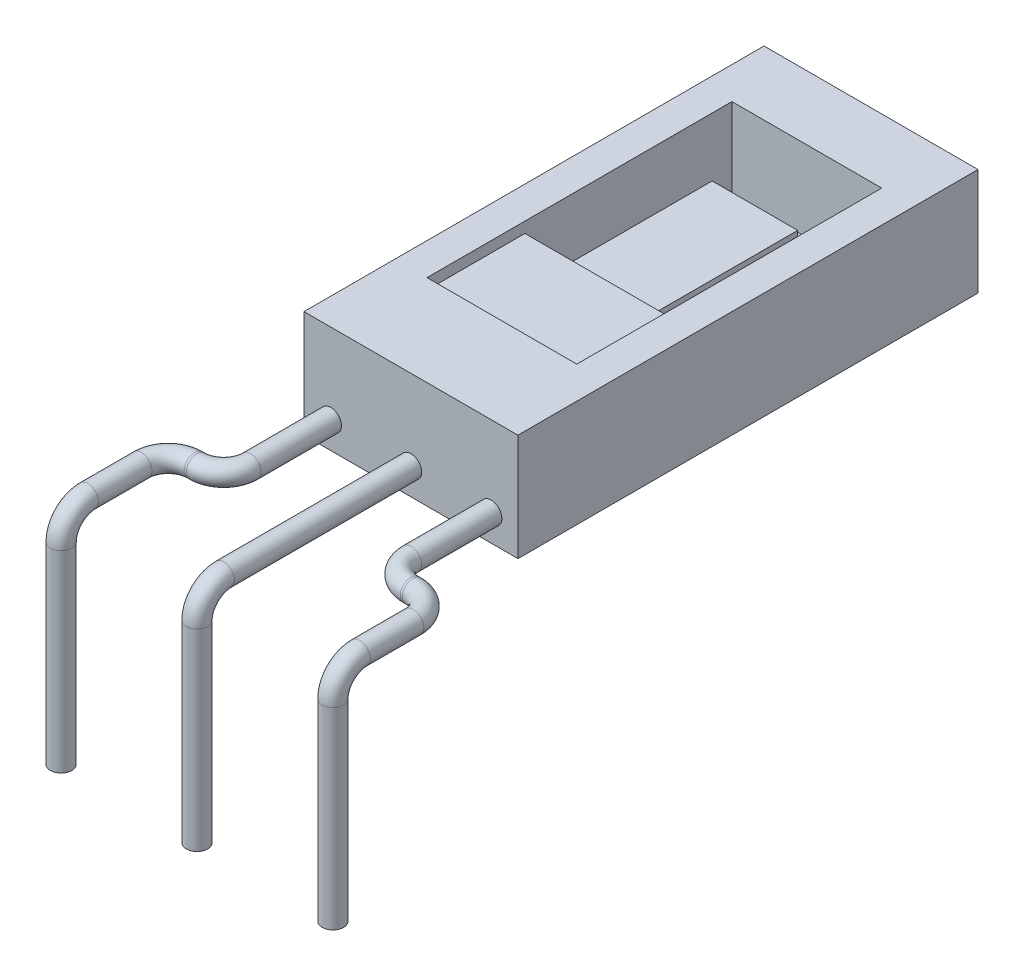
ISO-10303-21;
HEADER;
FILE_DESCRIPTION(('STEP AP214'),'2;1');
FILE_NAME('part.step','',(''),(''),'','','');
FILE_SCHEMA(('AUTOMOTIVE_DESIGN { 1 0 10303 214 1 1 1 1 }'));
ENDSEC;
DATA;
#1=APPLICATION_CONTEXT('core data for automotive mechanical design processes');
#2=APPLICATION_PROTOCOL_DEFINITION('international standard','automotive_design',2000,#1);
#3=PRODUCT_CONTEXT('',#1,'mechanical');
#4=PRODUCT('Part','Part','',(#3));
#5=PRODUCT_RELATED_PRODUCT_CATEGORY('part','',(#4));
#6=PRODUCT_DEFINITION_FORMATION('','',#4);
#7=PRODUCT_DEFINITION_CONTEXT('part definition',#1,'design');
#8=PRODUCT_DEFINITION('design','',#6,#7);
#9=PRODUCT_DEFINITION_SHAPE('','',#8);
#10=(LENGTH_UNIT() NAMED_UNIT(*) SI_UNIT(.MILLI.,.METRE.));
#11=(NAMED_UNIT(*) PLANE_ANGLE_UNIT() SI_UNIT($,.RADIAN.));
#12=(NAMED_UNIT(*) SI_UNIT($,.STERADIAN.) SOLID_ANGLE_UNIT());
#13=UNCERTAINTY_MEASURE_WITH_UNIT(LENGTH_MEASURE(1.E-05),#10,'distance_accuracy_value','');
#14=(GEOMETRIC_REPRESENTATION_CONTEXT(3) GLOBAL_UNCERTAINTY_ASSIGNED_CONTEXT((#13)) GLOBAL_UNIT_ASSIGNED_CONTEXT((#10,
#11,#12)) REPRESENTATION_CONTEXT('',''));
#15=CARTESIAN_POINT('',(0.,0.,0.));
#16=DIRECTION('',(0.,0.,1.));
#17=DIRECTION('',(1.,0.,0.));
#18=AXIS2_PLACEMENT_3D('',#15,#16,#17);
#19=CARTESIAN_POINT('',(-2.,2.,0.));
#20=DIRECTION('',(0.,0.,-1.));
#21=DIRECTION('',(-1.,0.,0.));
#22=AXIS2_PLACEMENT_3D('',#19,#20,#21);
#23=PLANE('',#22);
#24=CARTESIAN_POINT('',(1.5,0.5,0.));
#25=DIRECTION('',(0.,0.,-1.));
#26=DIRECTION('',(-1.,0.,0.));
#27=AXIS2_PLACEMENT_3D('',#24,#25,#26);
#28=CIRCLE('',#27,0.2);
#29=CARTESIAN_POINT('',(1.3,0.5,0.));
#30=VERTEX_POINT('',#29);
#31=EDGE_CURVE('E301',#30,#30,#28,.T.);
#32=ORIENTED_EDGE('',*,*,#31,.T.);
#33=EDGE_LOOP('',(#32));
#34=FACE_BOUND('',#33,.T.);
#35=CARTESIAN_POINT('',(0.,0.5,0.));
#36=DIRECTION('',(0.,0.,1.));
#37=DIRECTION('',(1.,0.,0.));
#38=AXIS2_PLACEMENT_3D('',#35,#36,#37);
#39=CIRCLE('',#38,0.2);
#40=CARTESIAN_POINT('',(0.2,0.5,0.));
#41=VERTEX_POINT('',#40);
#42=EDGE_CURVE('E46',#41,#41,#39,.T.);
#43=ORIENTED_EDGE('',*,*,#42,.F.);
#44=EDGE_LOOP('',(#43));
#45=FACE_BOUND('',#44,.T.);
#46=DIRECTION('',(1.,0.,0.));
#47=VECTOR('',#46,1.);
#48=CARTESIAN_POINT('',(-2.,0.,0.));
#49=LINE('',#48,#47);
#50=CARTESIAN_POINT('',(-2.,0.,0.));
#51=VERTEX_POINT('',#50);
#52=CARTESIAN_POINT('',(2.,0.,0.));
#53=VERTEX_POINT('',#52);
#54=EDGE_CURVE('E195',#51,#53,#49,.T.);
#55=ORIENTED_EDGE('',*,*,#54,.T.);
#56=DIRECTION('',(0.,-1.,0.));
#57=VECTOR('',#56,1.);
#58=CARTESIAN_POINT('',(2.,2.,0.));
#59=LINE('',#58,#57);
#60=CARTESIAN_POINT('',(2.,2.,0.));
#61=VERTEX_POINT('',#60);
#62=EDGE_CURVE('E169',#61,#53,#59,.T.);
#63=ORIENTED_EDGE('',*,*,#62,.F.);
#64=DIRECTION('',(1.,0.,0.));
#65=VECTOR('',#64,1.);
#66=CARTESIAN_POINT('',(-2.,2.,0.));
#67=LINE('',#66,#65);
#68=CARTESIAN_POINT('',(-2.,2.,0.));
#69=VERTEX_POINT('',#68);
#70=EDGE_CURVE('E186',#69,#61,#67,.T.);
#71=ORIENTED_EDGE('',*,*,#70,.F.);
#72=DIRECTION('',(0.,-1.,0.));
#73=VECTOR('',#72,1.);
#74=CARTESIAN_POINT('',(-2.,2.,0.));
#75=LINE('',#74,#73);
#76=EDGE_CURVE('E167',#69,#51,#75,.T.);
#77=ORIENTED_EDGE('',*,*,#76,.T.);
#78=EDGE_LOOP('',(#55,#63,#71,#77));
#79=FACE_BOUND('',#78,.T.);
#80=CARTESIAN_POINT('',(-1.5,0.5,0.));
#81=DIRECTION('',(0.,0.,1.));
#82=DIRECTION('',(1.,0.,0.));
#83=AXIS2_PLACEMENT_3D('',#80,#81,#82);
#84=CIRCLE('',#83,0.2);
#85=CARTESIAN_POINT('',(-1.3,0.5,0.));
#86=VERTEX_POINT('',#85);
#87=EDGE_CURVE('E11',#86,#86,#84,.T.);
#88=ORIENTED_EDGE('',*,*,#87,.F.);
#89=EDGE_LOOP('',(#88));
#90=FACE_BOUND('',#89,.T.);
#91=ADVANCED_FACE('F37',(#34,#45,#79,#90),#23,.F.);
#92=CARTESIAN_POINT('',(-1.4,0.5,-1.7));
#93=DIRECTION('',(0.,1.,0.));
#94=DIRECTION('',(0.,0.,1.));
#95=AXIS2_PLACEMENT_3D('',#92,#93,#94);
#96=PLANE('',#95);
#97=DIRECTION('',(1.,0.,0.));
#98=VECTOR('',#97,1.);
#99=CARTESIAN_POINT('',(-1.4,0.5,-3.53));
#100=LINE('',#99,#98);
#101=CARTESIAN_POINT('',(-1.4,0.5,-3.53));
#102=VERTEX_POINT('',#101);
#103=CARTESIAN_POINT('',(-0.8,0.5,-3.53));
#104=VERTEX_POINT('',#103);
#105=EDGE_CURVE('E41',#102,#104,#100,.T.);
#106=ORIENTED_EDGE('',*,*,#105,.T.);
#107=DIRECTION('',(0.,0.,1.));
#108=VECTOR('',#107,1.);
#109=CARTESIAN_POINT('',(-0.8,0.5,-6.43));
#110=LINE('',#109,#108);
#111=CARTESIAN_POINT('',(-0.8,0.5,-6.43));
#112=VERTEX_POINT('',#111);
#113=EDGE_CURVE('E141',#112,#104,#110,.T.);
#114=ORIENTED_EDGE('',*,*,#113,.F.);
#115=DIRECTION('',(-1.,0.,0.));
#116=VECTOR('',#115,1.);
#117=CARTESIAN_POINT('',(-0.8,0.5,-6.43));
#118=LINE('',#117,#116);
#119=CARTESIAN_POINT('',(0.800000000000001,0.5,-6.43));
#120=VERTEX_POINT('',#119);
#121=EDGE_CURVE('E248',#120,#112,#118,.T.);
#122=ORIENTED_EDGE('',*,*,#121,.F.);
#123=DIRECTION('',(0.,0.,-1.));
#124=VECTOR('',#123,1.);
#125=CARTESIAN_POINT('',(0.800000000000001,0.5,-6.43));
#126=LINE('',#125,#124);
#127=CARTESIAN_POINT('',(0.800000000000001,0.5,-3.53));
#128=VERTEX_POINT('',#127);
#129=EDGE_CURVE('E147',#128,#120,#126,.T.);
#130=ORIENTED_EDGE('',*,*,#129,.F.);
#131=CARTESIAN_POINT('',(1.4,0.5,-3.53));
#132=VERTEX_POINT('',#131);
#133=EDGE_CURVE('E62',#128,#132,#100,.T.);
#134=ORIENTED_EDGE('',*,*,#133,.T.);
#135=DIRECTION('',(0.,0.,-1.));
#136=VECTOR('',#135,1.);
#137=CARTESIAN_POINT('',(1.4,0.5,-7.4));
#138=LINE('',#137,#136);
#139=CARTESIAN_POINT('',(1.4,0.5,-7.4));
#140=VERTEX_POINT('',#139);
#141=EDGE_CURVE('E209',#132,#140,#138,.T.);
#142=ORIENTED_EDGE('',*,*,#141,.T.);
#143=DIRECTION('',(-1.,0.,0.));
#144=VECTOR('',#143,1.);
#145=CARTESIAN_POINT('',(-1.4,0.5,-7.4));
#146=LINE('',#145,#144);
#147=CARTESIAN_POINT('',(-1.4,0.5,-7.4));
#148=VERTEX_POINT('',#147);
#149=EDGE_CURVE('E203',#140,#148,#146,.T.);
#150=ORIENTED_EDGE('',*,*,#149,.T.);
#151=DIRECTION('',(0.,0.,1.));
#152=VECTOR('',#151,1.);
#153=CARTESIAN_POINT('',(-1.4,0.5,-7.4));
#154=LINE('',#153,#152);
#155=EDGE_CURVE('E164',#148,#102,#154,.T.);
#156=ORIENTED_EDGE('',*,*,#155,.T.);
#157=EDGE_LOOP('',(#106,#114,#122,#130,#134,#142,#150,#156));
#158=FACE_BOUND('',#157,.T.);
#159=ADVANCED_FACE('F161',(#158),#96,.T.);
#160=CARTESIAN_POINT('',(-1.4,1.8,-3.53));
#161=DIRECTION('',(0.,0.,1.));
#162=DIRECTION('',(1.,0.,0.));
#163=AXIS2_PLACEMENT_3D('',#160,#161,#162);
#164=PLANE('',#163);
#165=DIRECTION('',(0.,-1.,0.));
#166=VECTOR('',#165,1.);
#167=CARTESIAN_POINT('',(-0.8,1.5,-3.53));
#168=LINE('',#167,#166);
#169=CARTESIAN_POINT('',(-0.8,1.5,-3.53));
#170=VERTEX_POINT('',#169);
#171=EDGE_CURVE('E54',#170,#104,#168,.T.);
#172=ORIENTED_EDGE('',*,*,#171,.T.);
#173=ORIENTED_EDGE('',*,*,#105,.F.);
#174=DIRECTION('',(0.,-1.,0.));
#175=VECTOR('',#174,1.);
#176=CARTESIAN_POINT('',(-1.4,1.8,-3.53));
#177=LINE('',#176,#175);
#178=CARTESIAN_POINT('',(-1.4,1.8,-3.53));
#179=VERTEX_POINT('',#178);
#180=EDGE_CURVE('E229',#179,#102,#177,.T.);
#181=ORIENTED_EDGE('',*,*,#180,.F.);
#182=DIRECTION('',(-1.,0.,0.));
#183=VECTOR('',#182,1.);
#184=CARTESIAN_POINT('',(-1.4,1.8,-3.53));
#185=LINE('',#184,#183);
#186=CARTESIAN_POINT('',(1.4,1.8,-3.53));
#187=VERTEX_POINT('',#186);
#188=EDGE_CURVE('E231',#187,#179,#185,.T.);
#189=ORIENTED_EDGE('',*,*,#188,.F.);
#190=DIRECTION('',(0.,-1.,0.));
#191=VECTOR('',#190,1.);
#192=CARTESIAN_POINT('',(1.4,0.5,-3.53));
#193=LINE('',#192,#191);
#194=EDGE_CURVE('E227',#187,#132,#193,.T.);
#195=ORIENTED_EDGE('',*,*,#194,.T.);
#196=ORIENTED_EDGE('',*,*,#133,.F.);
#197=DIRECTION('',(0.,-1.,0.));
#198=VECTOR('',#197,1.);
#199=CARTESIAN_POINT('',(0.800000000000001,1.5,-3.53));
#200=LINE('',#199,#198);
#201=CARTESIAN_POINT('',(0.800000000000001,1.5,-3.53));
#202=VERTEX_POINT('',#201);
#203=EDGE_CURVE('E158',#202,#128,#200,.T.);
#204=ORIENTED_EDGE('',*,*,#203,.F.);
#205=DIRECTION('',(1.,0.,0.));
#206=VECTOR('',#205,1.);
#207=CARTESIAN_POINT('',(-0.8,1.5,-3.53));
#208=LINE('',#207,#206);
#209=EDGE_CURVE('E156',#170,#202,#208,.T.);
#210=ORIENTED_EDGE('',*,*,#209,.F.);
#211=EDGE_LOOP('',(#172,#173,#181,#189,#195,#196,#204,#210));
#212=FACE_BOUND('',#211,.T.);
#213=ADVANCED_FACE('F152',(#212),#164,.F.);
#214=CARTESIAN_POINT('',(-1.4,0.5,-7.4));
#215=DIRECTION('',(-1.,0.,0.));
#216=DIRECTION('',(0.,0.,1.));
#217=AXIS2_PLACEMENT_3D('',#214,#215,#216);
#218=PLANE('',#217);
#219=ORIENTED_EDGE('',*,*,#180,.T.);
#220=ORIENTED_EDGE('',*,*,#155,.F.);
#221=DIRECTION('',(0.,1.,0.));
#222=VECTOR('',#221,1.);
#223=CARTESIAN_POINT('',(-1.4,0.5,-7.4));
#224=LINE('',#223,#222);
#225=CARTESIAN_POINT('',(-1.4,2.,-7.4));
#226=VERTEX_POINT('',#225);
#227=EDGE_CURVE('E199',#148,#226,#224,.T.);
#228=ORIENTED_EDGE('',*,*,#227,.T.);
#229=DIRECTION('',(0.,0.,1.));
#230=VECTOR('',#229,1.);
#231=CARTESIAN_POINT('',(-1.4,2.,-7.4));
#232=LINE('',#231,#230);
#233=CARTESIAN_POINT('',(-1.4,2.,-1.7));
#234=VERTEX_POINT('',#233);
#235=EDGE_CURVE('E221',#226,#234,#232,.T.);
#236=ORIENTED_EDGE('',*,*,#235,.T.);
#237=DIRECTION('',(0.,1.,0.));
#238=VECTOR('',#237,1.);
#239=CARTESIAN_POINT('',(-1.4,0.5,-1.7));
#240=LINE('',#239,#238);
#241=CARTESIAN_POINT('',(-1.4,1.8,-1.7));
#242=VERTEX_POINT('',#241);
#243=EDGE_CURVE('E200',#242,#234,#240,.T.);
#244=ORIENTED_EDGE('',*,*,#243,.F.);
#245=DIRECTION('',(0.,0.,1.));
#246=VECTOR('',#245,1.);
#247=CARTESIAN_POINT('',(-1.4,1.8,-3.53));
#248=LINE('',#247,#246);
#249=EDGE_CURVE('E157',#179,#242,#248,.T.);
#250=ORIENTED_EDGE('',*,*,#249,.F.);
#251=EDGE_LOOP('',(#219,#220,#228,#236,#244,#250));
#252=FACE_BOUND('',#251,.T.);
#253=ADVANCED_FACE('F345',(#252),#218,.F.);
#254=CARTESIAN_POINT('',(1.4,0.5,-7.4));
#255=DIRECTION('',(1.,0.,0.));
#256=DIRECTION('',(0.,0.,-1.));
#257=AXIS2_PLACEMENT_3D('',#254,#255,#256);
#258=PLANE('',#257);
#259=ORIENTED_EDGE('',*,*,#194,.F.);
#260=DIRECTION('',(0.,0.,1.));
#261=VECTOR('',#260,1.);
#262=CARTESIAN_POINT('',(1.4,1.8,-7.4));
#263=LINE('',#262,#261);
#264=CARTESIAN_POINT('',(1.4,1.8,-1.7));
#265=VERTEX_POINT('',#264);
#266=EDGE_CURVE('E224',#187,#265,#263,.T.);
#267=ORIENTED_EDGE('',*,*,#266,.T.);
#268=DIRECTION('',(0.,1.,0.));
#269=VECTOR('',#268,1.);
#270=CARTESIAN_POINT('',(1.4,0.5,-1.7));
#271=LINE('',#270,#269);
#272=CARTESIAN_POINT('',(1.4,2.,-1.7));
#273=VERTEX_POINT('',#272);
#274=EDGE_CURVE('E202',#265,#273,#271,.T.);
#275=ORIENTED_EDGE('',*,*,#274,.T.);
#276=DIRECTION('',(0.,0.,-1.));
#277=VECTOR('',#276,1.);
#278=CARTESIAN_POINT('',(1.4,2.,-7.4));
#279=LINE('',#278,#277);
#280=CARTESIAN_POINT('',(1.4,2.,-7.4));
#281=VERTEX_POINT('',#280);
#282=EDGE_CURVE('E215',#273,#281,#279,.T.);
#283=ORIENTED_EDGE('',*,*,#282,.T.);
#284=DIRECTION('',(0.,1.,0.));
#285=VECTOR('',#284,1.);
#286=CARTESIAN_POINT('',(1.4,0.5,-7.4));
#287=LINE('',#286,#285);
#288=EDGE_CURVE('E205',#140,#281,#287,.T.);
#289=ORIENTED_EDGE('',*,*,#288,.F.);
#290=ORIENTED_EDGE('',*,*,#141,.F.);
#291=EDGE_LOOP('',(#259,#267,#275,#283,#289,#290));
#292=FACE_BOUND('',#291,.T.);
#293=ADVANCED_FACE('F348',(#292),#258,.F.);
#294=CARTESIAN_POINT('',(-2.,2.,-8.6));
#295=DIRECTION('',(1.,0.,0.));
#296=DIRECTION('',(0.,0.,-1.));
#297=AXIS2_PLACEMENT_3D('',#294,#295,#296);
#298=PLANE('',#297);
#299=DIRECTION('',(0.,0.,1.));
#300=VECTOR('',#299,1.);
#301=CARTESIAN_POINT('',(-2.,0.,-8.6));
#302=LINE('',#301,#300);
#303=CARTESIAN_POINT('',(-2.,0.,-8.6));
#304=VERTEX_POINT('',#303);
#305=EDGE_CURVE('E197',#304,#51,#302,.T.);
#306=ORIENTED_EDGE('',*,*,#305,.T.);
#307=ORIENTED_EDGE('',*,*,#76,.F.);
#308=DIRECTION('',(0.,0.,1.));
#309=VECTOR('',#308,1.);
#310=CARTESIAN_POINT('',(-2.,2.,-8.6));
#311=LINE('',#310,#309);
#312=CARTESIAN_POINT('',(-2.,2.,-8.6));
#313=VERTEX_POINT('',#312);
#314=EDGE_CURVE('E188',#313,#69,#311,.T.);
#315=ORIENTED_EDGE('',*,*,#314,.F.);
#316=DIRECTION('',(0.,-1.,0.));
#317=VECTOR('',#316,1.);
#318=CARTESIAN_POINT('',(-2.,2.,-8.6));
#319=LINE('',#318,#317);
#320=EDGE_CURVE('E179',#313,#304,#319,.T.);
#321=ORIENTED_EDGE('',*,*,#320,.T.);
#322=EDGE_LOOP('',(#306,#307,#315,#321));
#323=FACE_BOUND('',#322,.T.);
#324=ADVANCED_FACE('F39',(#323),#298,.F.);
#325=CARTESIAN_POINT('',(2.,2.,-8.6));
#326=DIRECTION('',(-1.,0.,0.));
#327=DIRECTION('',(0.,0.,1.));
#328=AXIS2_PLACEMENT_3D('',#325,#326,#327);
#329=PLANE('',#328);
#330=DIRECTION('',(0.,0.,-1.));
#331=VECTOR('',#330,1.);
#332=CARTESIAN_POINT('',(2.,0.,-8.6));
#333=LINE('',#332,#331);
#334=CARTESIAN_POINT('',(2.,0.,-8.6));
#335=VERTEX_POINT('',#334);
#336=EDGE_CURVE('E193',#53,#335,#333,.T.);
#337=ORIENTED_EDGE('',*,*,#336,.T.);
#338=DIRECTION('',(0.,-1.,0.));
#339=VECTOR('',#338,1.);
#340=CARTESIAN_POINT('',(2.,2.,-8.6));
#341=LINE('',#340,#339);
#342=CARTESIAN_POINT('',(2.,2.,-8.6));
#343=VERTEX_POINT('',#342);
#344=EDGE_CURVE('E174',#343,#335,#341,.T.);
#345=ORIENTED_EDGE('',*,*,#344,.F.);
#346=DIRECTION('',(0.,0.,-1.));
#347=VECTOR('',#346,1.);
#348=CARTESIAN_POINT('',(2.,2.,-8.6));
#349=LINE('',#348,#347);
#350=EDGE_CURVE('E184',#61,#343,#349,.T.);
#351=ORIENTED_EDGE('',*,*,#350,.F.);
#352=ORIENTED_EDGE('',*,*,#62,.T.);
#353=EDGE_LOOP('',(#337,#345,#351,#352));
#354=FACE_BOUND('',#353,.T.);
#355=ADVANCED_FACE('F328',(#354),#329,.F.);
#356=CARTESIAN_POINT('',(-2.,2.,-8.6));
#357=DIRECTION('',(0.,0.,1.));
#358=DIRECTION('',(1.,0.,0.));
#359=AXIS2_PLACEMENT_3D('',#356,#357,#358);
#360=PLANE('',#359);
#361=DIRECTION('',(-1.,0.,0.));
#362=VECTOR('',#361,1.);
#363=CARTESIAN_POINT('',(-2.,0.,-8.6));
#364=LINE('',#363,#362);
#365=EDGE_CURVE('E191',#335,#304,#364,.T.);
#366=ORIENTED_EDGE('',*,*,#365,.T.);
#367=ORIENTED_EDGE('',*,*,#320,.F.);
#368=DIRECTION('',(-1.,0.,0.));
#369=VECTOR('',#368,1.);
#370=CARTESIAN_POINT('',(-2.,2.,-8.6));
#371=LINE('',#370,#369);
#372=EDGE_CURVE('E182',#343,#313,#371,.T.);
#373=ORIENTED_EDGE('',*,*,#372,.F.);
#374=ORIENTED_EDGE('',*,*,#344,.T.);
#375=EDGE_LOOP('',(#366,#367,#373,#374));
#376=FACE_BOUND('',#375,.T.);
#377=ADVANCED_FACE('F331',(#376),#360,.F.);
#378=CARTESIAN_POINT('',(-2.,2.,0.));
#379=DIRECTION('',(0.,1.,0.));
#380=DIRECTION('',(0.,0.,1.));
#381=AXIS2_PLACEMENT_3D('',#378,#379,#380);
#382=PLANE('',#381);
#383=ORIENTED_EDGE('',*,*,#235,.F.);
#384=DIRECTION('',(-1.,0.,0.));
#385=VECTOR('',#384,1.);
#386=CARTESIAN_POINT('',(-1.4,2.,-7.4));
#387=LINE('',#386,#385);
#388=EDGE_CURVE('E212',#281,#226,#387,.T.);
#389=ORIENTED_EDGE('',*,*,#388,.F.);
#390=ORIENTED_EDGE('',*,*,#282,.F.);
#391=DIRECTION('',(1.,0.,0.));
#392=VECTOR('',#391,1.);
#393=CARTESIAN_POINT('',(-1.4,2.,-1.7));
#394=LINE('',#393,#392);
#395=EDGE_CURVE('E218',#234,#273,#394,.T.);
#396=ORIENTED_EDGE('',*,*,#395,.F.);
#397=EDGE_LOOP('',(#383,#389,#390,#396));
#398=FACE_BOUND('',#397,.T.);
#399=ORIENTED_EDGE('',*,*,#314,.T.);
#400=ORIENTED_EDGE('',*,*,#70,.T.);
#401=ORIENTED_EDGE('',*,*,#350,.T.);
#402=ORIENTED_EDGE('',*,*,#372,.T.);
#403=EDGE_LOOP('',(#399,#400,#401,#402));
#404=FACE_BOUND('',#403,.T.);
#405=ADVANCED_FACE('F335',(#398,#404),#382,.T.);
#406=CARTESIAN_POINT('',(-2.,0.,0.));
#407=DIRECTION('',(0.,1.,0.));
#408=DIRECTION('',(0.,0.,1.));
#409=AXIS2_PLACEMENT_3D('',#406,#407,#408);
#410=PLANE('',#409);
#411=ORIENTED_EDGE('',*,*,#305,.F.);
#412=ORIENTED_EDGE('',*,*,#365,.F.);
#413=ORIENTED_EDGE('',*,*,#336,.F.);
#414=ORIENTED_EDGE('',*,*,#54,.F.);
#415=EDGE_LOOP('',(#411,#412,#413,#414));
#416=FACE_BOUND('',#415,.T.);
#417=ADVANCED_FACE('F339',(#416),#410,.F.);
#418=CARTESIAN_POINT('',(-1.4,0.5,-7.4));
#419=DIRECTION('',(0.,0.,-1.));
#420=DIRECTION('',(-1.,0.,0.));
#421=AXIS2_PLACEMENT_3D('',#418,#419,#420);
#422=PLANE('',#421);
#423=ORIENTED_EDGE('',*,*,#388,.T.);
#424=ORIENTED_EDGE('',*,*,#227,.F.);
#425=ORIENTED_EDGE('',*,*,#149,.F.);
#426=ORIENTED_EDGE('',*,*,#288,.T.);
#427=EDGE_LOOP('',(#423,#424,#425,#426));
#428=FACE_BOUND('',#427,.T.);
#429=ADVANCED_FACE('F343',(#428),#422,.F.);
#430=CARTESIAN_POINT('',(-1.4,0.5,-1.7));
#431=DIRECTION('',(0.,0.,1.));
#432=DIRECTION('',(1.,0.,0.));
#433=AXIS2_PLACEMENT_3D('',#430,#431,#432);
#434=PLANE('',#433);
#435=ORIENTED_EDGE('',*,*,#274,.F.);
#436=DIRECTION('',(1.,0.,0.));
#437=VECTOR('',#436,1.);
#438=CARTESIAN_POINT('',(-1.4,1.8,-1.7));
#439=LINE('',#438,#437);
#440=EDGE_CURVE('E233',#242,#265,#439,.T.);
#441=ORIENTED_EDGE('',*,*,#440,.F.);
#442=ORIENTED_EDGE('',*,*,#243,.T.);
#443=ORIENTED_EDGE('',*,*,#395,.T.);
#444=EDGE_LOOP('',(#435,#441,#442,#443));
#445=FACE_BOUND('',#444,.T.);
#446=ADVANCED_FACE('F350',(#445),#434,.F.);
#447=CARTESIAN_POINT('',(-1.4,1.8,-1.7));
#448=DIRECTION('',(0.,1.,0.));
#449=DIRECTION('',(0.,0.,1.));
#450=AXIS2_PLACEMENT_3D('',#447,#448,#449);
#451=PLANE('',#450);
#452=ORIENTED_EDGE('',*,*,#266,.F.);
#453=ORIENTED_EDGE('',*,*,#188,.T.);
#454=ORIENTED_EDGE('',*,*,#249,.T.);
#455=ORIENTED_EDGE('',*,*,#440,.T.);
#456=EDGE_LOOP('',(#452,#453,#454,#455));
#457=FACE_BOUND('',#456,.T.);
#458=ADVANCED_FACE('F353',(#457),#451,.T.);
#459=CARTESIAN_POINT('',(-0.8,1.5,-6.43));
#460=DIRECTION('',(1.,0.,0.));
#461=DIRECTION('',(0.,0.,-1.));
#462=AXIS2_PLACEMENT_3D('',#459,#460,#461);
#463=PLANE('',#462);
#464=ORIENTED_EDGE('',*,*,#113,.T.);
#465=ORIENTED_EDGE('',*,*,#171,.F.);
#466=DIRECTION('',(0.,0.,1.));
#467=VECTOR('',#466,1.);
#468=CARTESIAN_POINT('',(-0.8,1.5,-6.43));
#469=LINE('',#468,#467);
#470=CARTESIAN_POINT('',(-0.8,1.5,-6.43));
#471=VERTEX_POINT('',#470);
#472=EDGE_CURVE('E246',#471,#170,#469,.T.);
#473=ORIENTED_EDGE('',*,*,#472,.F.);
#474=DIRECTION('',(0.,-1.,0.));
#475=VECTOR('',#474,1.);
#476=CARTESIAN_POINT('',(-0.8,1.5,-6.43));
#477=LINE('',#476,#475);
#478=EDGE_CURVE('E144',#471,#112,#477,.T.);
#479=ORIENTED_EDGE('',*,*,#478,.T.);
#480=EDGE_LOOP('',(#464,#465,#473,#479));
#481=FACE_BOUND('',#480,.T.);
#482=ADVANCED_FACE('F142',(#481),#463,.F.);
#483=CARTESIAN_POINT('',(0.800000000000001,1.5,-6.43));
#484=DIRECTION('',(-1.,0.,0.));
#485=DIRECTION('',(0.,0.,1.));
#486=AXIS2_PLACEMENT_3D('',#483,#484,#485);
#487=PLANE('',#486);
#488=ORIENTED_EDGE('',*,*,#129,.T.);
#489=DIRECTION('',(0.,-1.,0.));
#490=VECTOR('',#489,1.);
#491=CARTESIAN_POINT('',(0.800000000000001,1.5,-6.43));
#492=LINE('',#491,#490);
#493=CARTESIAN_POINT('',(0.800000000000001,1.5,-6.43));
#494=VERTEX_POINT('',#493);
#495=EDGE_CURVE('E237',#494,#120,#492,.T.);
#496=ORIENTED_EDGE('',*,*,#495,.F.);
#497=DIRECTION('',(0.,0.,-1.));
#498=VECTOR('',#497,1.);
#499=CARTESIAN_POINT('',(0.800000000000001,1.5,-6.43));
#500=LINE('',#499,#498);
#501=EDGE_CURVE('E243',#202,#494,#500,.T.);
#502=ORIENTED_EDGE('',*,*,#501,.F.);
#503=ORIENTED_EDGE('',*,*,#203,.T.);
#504=EDGE_LOOP('',(#488,#496,#502,#503));
#505=FACE_BOUND('',#504,.T.);
#506=ADVANCED_FACE('F368',(#505),#487,.F.);
#507=CARTESIAN_POINT('',(-0.8,1.5,-6.43));
#508=DIRECTION('',(0.,0.,1.));
#509=DIRECTION('',(1.,0.,0.));
#510=AXIS2_PLACEMENT_3D('',#507,#508,#509);
#511=PLANE('',#510);
#512=ORIENTED_EDGE('',*,*,#121,.T.);
#513=ORIENTED_EDGE('',*,*,#478,.F.);
#514=DIRECTION('',(-1.,0.,0.));
#515=VECTOR('',#514,1.);
#516=CARTESIAN_POINT('',(-0.8,1.5,-6.43));
#517=LINE('',#516,#515);
#518=EDGE_CURVE('E241',#494,#471,#517,.T.);
#519=ORIENTED_EDGE('',*,*,#518,.F.);
#520=ORIENTED_EDGE('',*,*,#495,.T.);
#521=EDGE_LOOP('',(#512,#513,#519,#520));
#522=FACE_BOUND('',#521,.T.);
#523=ADVANCED_FACE('F371',(#522),#511,.F.);
#524=CARTESIAN_POINT('',(-0.8,1.5,-3.53));
#525=DIRECTION('',(0.,1.,0.));
#526=DIRECTION('',(0.,0.,1.));
#527=AXIS2_PLACEMENT_3D('',#524,#525,#526);
#528=PLANE('',#527);
#529=ORIENTED_EDGE('',*,*,#472,.T.);
#530=ORIENTED_EDGE('',*,*,#209,.T.);
#531=ORIENTED_EDGE('',*,*,#501,.T.);
#532=ORIENTED_EDGE('',*,*,#518,.T.);
#533=EDGE_LOOP('',(#529,#530,#531,#532));
#534=FACE_BOUND('',#533,.T.);
#535=ADVANCED_FACE('F375',(#534),#528,.T.);
#536=CARTESIAN_POINT('',(0.,0.,4.));
#537=DIRECTION('',(0.,-1.,0.));
#538=DIRECTION('',(0.,0.,-1.));
#539=AXIS2_PLACEMENT_3D('',#536,#537,#538);
#540=CYLINDRICAL_SURFACE('',#539,0.2);
#541=CARTESIAN_POINT('',(0.,0.,4.));
#542=DIRECTION('',(0.,-1.,0.));
#543=DIRECTION('',(1.,0.,0.));
#544=AXIS2_PLACEMENT_3D('',#541,#542,#543);
#545=CIRCLE('',#544,0.2);
#546=CARTESIAN_POINT('',(0.,0.,4.2));
#547=VERTEX_POINT('',#546);
#548=EDGE_CURVE('E253',#547,#547,#545,.T.);
#549=ORIENTED_EDGE('',*,*,#548,.T.);
#550=EDGE_LOOP('',(#549));
#551=FACE_BOUND('',#550,.T.);
#552=CARTESIAN_POINT('',(0.,-3.6,4.));
#553=DIRECTION('',(0.,-1.,0.));
#554=DIRECTION('',(1.,0.,0.));
#555=AXIS2_PLACEMENT_3D('',#552,#553,#554);
#556=CIRCLE('',#555,0.2);
#557=CARTESIAN_POINT('',(0.2,-3.6,4.));
#558=VERTEX_POINT('',#557);
#559=EDGE_CURVE('E148',#558,#558,#556,.T.);
#560=ORIENTED_EDGE('',*,*,#559,.F.);
#561=EDGE_LOOP('',(#560));
#562=FACE_BOUND('',#561,.T.);
#563=ADVANCED_FACE('F379',(#551,#562),#540,.T.);
#564=CARTESIAN_POINT('',(0.,0.,3.5));
#565=DIRECTION('',(1.,0.,0.));
#566=DIRECTION('',(0.,0.,-1.));
#567=AXIS2_PLACEMENT_3D('',#564,#565,#566);
#568=TOROIDAL_SURFACE('',#567,0.5,0.2);
#569=CARTESIAN_POINT('',(0.,0.5,3.5));
#570=DIRECTION('',(0.,0.,1.));
#571=DIRECTION('',(1.,0.,0.));
#572=AXIS2_PLACEMENT_3D('',#569,#570,#571);
#573=CIRCLE('',#572,0.2);
#574=CARTESIAN_POINT('',(0.,0.7,3.5));
#575=VERTEX_POINT('',#574);
#576=EDGE_CURVE('E256',#575,#575,#573,.T.);
#577=CARTESIAN_POINT('',(0.,0.,3.5));
#578=DIRECTION('',(1.,0.,0.));
#579=DIRECTION('',(0.,0.,-1.));
#580=AXIS2_PLACEMENT_3D('',#577,#578,#579);
#581=CIRCLE('',#580,0.7);
#582=EDGE_CURVE('',#575,#547,#581,.T.);
#583=ORIENTED_EDGE('',*,*,#576,.T.);
#584=ORIENTED_EDGE('',*,*,#548,.F.);
#585=ORIENTED_EDGE('',*,*,#582,.T.);
#586=ORIENTED_EDGE('',*,*,#582,.F.);
#587=EDGE_LOOP('',(#583,#585,#584,#586));
#588=FACE_BOUND('',#587,.T.);
#589=ADVANCED_FACE('F383',(#588),#568,.T.);
#590=CARTESIAN_POINT('',(0.,0.5,3.5));
#591=DIRECTION('',(0.,0.,-1.));
#592=DIRECTION('',(-1.,0.,0.));
#593=AXIS2_PLACEMENT_3D('',#590,#591,#592);
#594=CYLINDRICAL_SURFACE('',#593,0.2);
#595=ORIENTED_EDGE('',*,*,#576,.F.);
#596=EDGE_LOOP('',(#595));
#597=FACE_BOUND('',#596,.T.);
#598=ORIENTED_EDGE('',*,*,#42,.T.);
#599=EDGE_LOOP('',(#598));
#600=FACE_BOUND('',#599,.T.);
#601=ADVANCED_FACE('F387',(#597,#600),#594,.T.);
#602=CARTESIAN_POINT('',(0.,-3.6,4.));
#603=DIRECTION('',(0.,-1.,0.));
#604=DIRECTION('',(1.,0.,0.));
#605=AXIS2_PLACEMENT_3D('',#602,#603,#604);
#606=PLANE('',#605);
#607=ORIENTED_EDGE('',*,*,#559,.T.);
#608=EDGE_LOOP('',(#607));
#609=FACE_BOUND('',#608,.T.);
#610=ADVANCED_FACE('F391',(#609),#606,.T.);
#611=CARTESIAN_POINT('',(-2.54,-1.18225741696509E-11,4.));
#612=DIRECTION('',(0.,-1.,0.));
#613=DIRECTION('',(0.,0.,-1.));
#614=AXIS2_PLACEMENT_3D('',#611,#612,#613);
#615=CYLINDRICAL_SURFACE('',#614,0.2);
#616=CARTESIAN_POINT('',(-2.54,-1.18225741696509E-11,4.));
#617=DIRECTION('',(0.,-1.,5.91156515557765E-12));
#618=DIRECTION('',(1.,0.,-5.91150392525996E-12));
#619=AXIS2_PLACEMENT_3D('',#616,#617,#618);
#620=CIRCLE('',#619,0.2);
#621=CARTESIAN_POINT('',(-2.54,-1.18222272249557E-11,4.2));
#622=VERTEX_POINT('',#621);
#623=EDGE_CURVE('E262',#622,#622,#620,.T.);
#624=ORIENTED_EDGE('',*,*,#623,.T.);
#625=EDGE_LOOP('',(#624));
#626=FACE_BOUND('',#625,.T.);
#627=CARTESIAN_POINT('',(-2.54,-3.6,4.));
#628=DIRECTION('',(0.,-1.,5.91156515557765E-12));
#629=DIRECTION('',(1.,0.,-5.91150392525996E-12));
#630=AXIS2_PLACEMENT_3D('',#627,#628,#629);
#631=CIRCLE('',#630,0.2);
#632=CARTESIAN_POINT('',(-2.34,-3.6,3.99999999999882));
#633=VERTEX_POINT('',#632);
#634=EDGE_CURVE('E258',#633,#633,#631,.T.);
#635=ORIENTED_EDGE('',*,*,#634,.F.);
#636=EDGE_LOOP('',(#635));
#637=FACE_BOUND('',#636,.T.);
#638=ADVANCED_FACE('F395',(#626,#637),#615,.T.);
#639=CARTESIAN_POINT('',(-2.54,-1.18234415313889E-11,3.5));
#640=DIRECTION('',(1.,0.,0.));
#641=DIRECTION('',(0.,0.,-1.));
#642=AXIS2_PLACEMENT_3D('',#639,#640,#641);
#643=TOROIDAL_SURFACE('',#642,0.5,0.2);
#644=CARTESIAN_POINT('',(-2.54,0.499999999988177,3.5));
#645=DIRECTION('',(0.,5.91150392525996E-12,1.));
#646=DIRECTION('',(1.,-5.91150392525996E-12,0.));
#647=AXIS2_PLACEMENT_3D('',#644,#645,#646);
#648=CIRCLE('',#647,0.2);
#649=CARTESIAN_POINT('',(-2.54,0.699999999988177,3.5));
#650=VERTEX_POINT('',#649);
#651=EDGE_CURVE('E265',#650,#650,#648,.T.);
#652=CARTESIAN_POINT('',(-2.54,-1.18234415313889E-11,3.5));
#653=DIRECTION('',(1.,0.,0.));
#654=DIRECTION('',(0.,0.,-1.));
#655=AXIS2_PLACEMENT_3D('',#652,#653,#654);
#656=CIRCLE('',#655,0.7);
#657=EDGE_CURVE('',#650,#622,#656,.T.);
#658=ORIENTED_EDGE('',*,*,#651,.T.);
#659=ORIENTED_EDGE('',*,*,#623,.F.);
#660=ORIENTED_EDGE('',*,*,#657,.T.);
#661=ORIENTED_EDGE('',*,*,#657,.F.);
#662=EDGE_LOOP('',(#658,#660,#659,#661));
#663=FACE_BOUND('',#662,.T.);
#664=ADVANCED_FACE('F399',(#663),#643,.T.);
#665=CARTESIAN_POINT('',(-2.54,0.499999999988177,2.5));
#666=DIRECTION('',(0.,0.,1.));
#667=DIRECTION('',(1.,0.,0.));
#668=AXIS2_PLACEMENT_3D('',#665,#666,#667);
#669=CYLINDRICAL_SURFACE('',#668,0.2);
#670=CARTESIAN_POINT('',(-2.54,0.499999999988177,2.5));
#671=DIRECTION('',(0.,5.91150392525996E-12,1.));
#672=DIRECTION('',(1.,-5.91150392525996E-12,0.));
#673=AXIS2_PLACEMENT_3D('',#670,#671,#672);
#674=CIRCLE('',#673,0.2);
#675=CARTESIAN_POINT('',(-2.74,0.499999999988177,2.5));
#676=VERTEX_POINT('',#675);
#677=EDGE_CURVE('E268',#676,#676,#674,.T.);
#678=ORIENTED_EDGE('',*,*,#677,.T.);
#679=EDGE_LOOP('',(#678));
#680=FACE_BOUND('',#679,.T.);
#681=ORIENTED_EDGE('',*,*,#651,.F.);
#682=EDGE_LOOP('',(#681));
#683=FACE_BOUND('',#682,.T.);
#684=ADVANCED_FACE('F403',(#680,#683),#669,.T.);
#685=CARTESIAN_POINT('',(-2.04,0.499999999988177,2.5));
#686=DIRECTION('',(0.,1.,0.));
#687=DIRECTION('',(0.,0.,1.));
#688=AXIS2_PLACEMENT_3D('',#685,#686,#687);
#689=TOROIDAL_SURFACE('',#688,0.5,0.2);
#690=CARTESIAN_POINT('',(-2.04,0.499999999988177,2.));
#691=DIRECTION('',(-1.,5.91150392525996E-12,0.));
#692=DIRECTION('',(0.,-5.91150392525996E-12,1.));
#693=AXIS2_PLACEMENT_3D('',#690,#691,#692);
#694=CIRCLE('',#693,0.2);
#695=CARTESIAN_POINT('',(-2.04,0.499999999988177,1.8));
#696=VERTEX_POINT('',#695);
#697=EDGE_CURVE('E271',#696,#696,#694,.T.);
#698=CARTESIAN_POINT('',(-2.04,0.499999999988177,2.5));
#699=DIRECTION('',(0.,1.,0.));
#700=DIRECTION('',(0.,0.,1.));
#701=AXIS2_PLACEMENT_3D('',#698,#699,#700);
#702=CIRCLE('',#701,0.7);
#703=EDGE_CURVE('',#696,#676,#702,.T.);
#704=ORIENTED_EDGE('',*,*,#697,.T.);
#705=ORIENTED_EDGE('',*,*,#677,.F.);
#706=ORIENTED_EDGE('',*,*,#703,.T.);
#707=ORIENTED_EDGE('',*,*,#703,.F.);
#708=EDGE_LOOP('',(#704,#706,#705,#707));
#709=FACE_BOUND('',#708,.T.);
#710=ADVANCED_FACE('F407',(#709),#689,.T.);
#711=CARTESIAN_POINT('',(-2.,0.499999999988177,2.));
#712=DIRECTION('',(-1.,0.,0.));
#713=DIRECTION('',(0.,0.,1.));
#714=AXIS2_PLACEMENT_3D('',#711,#712,#713);
#715=CYLINDRICAL_SURFACE('',#714,0.2);
#716=CARTESIAN_POINT('',(-2.,0.499999999988177,2.));
#717=DIRECTION('',(-1.,5.91150392525996E-12,0.));
#718=DIRECTION('',(0.,-5.91150392525996E-12,1.));
#719=AXIS2_PLACEMENT_3D('',#716,#717,#718);
#720=CIRCLE('',#719,0.2);
#721=CARTESIAN_POINT('',(-2.,0.499999999986994,2.2));
#722=VERTEX_POINT('',#721);
#723=EDGE_CURVE('E274',#722,#722,#720,.T.);
#724=ORIENTED_EDGE('',*,*,#723,.T.);
#725=EDGE_LOOP('',(#724));
#726=FACE_BOUND('',#725,.T.);
#727=ORIENTED_EDGE('',*,*,#697,.F.);
#728=EDGE_LOOP('',(#727));
#729=FACE_BOUND('',#728,.T.);
#730=ADVANCED_FACE('F411',(#726,#729),#715,.T.);
#731=CARTESIAN_POINT('',(-2.,0.499999999991132,1.5));
#732=DIRECTION('',(0.,-1.,-5.91150392525996E-12));
#733=DIRECTION('',(0.,5.91150392525996E-12,-1.));
#734=AXIS2_PLACEMENT_3D('',#731,#732,#733);
#735=TOROIDAL_SURFACE('',#734,0.5,0.2);
#736=CARTESIAN_POINT('',(-1.5,0.499999999991132,1.5));
#737=DIRECTION('',(0.,0.,1.));
#738=DIRECTION('',(1.,0.,0.));
#739=AXIS2_PLACEMENT_3D('',#736,#737,#738);
#740=CIRCLE('',#739,0.2);
#741=CARTESIAN_POINT('',(-1.3,0.499999999991132,1.5));
#742=VERTEX_POINT('',#741);
#743=EDGE_CURVE('E277',#742,#742,#740,.T.);
#744=CARTESIAN_POINT('',(-2.,0.499999999991132,1.5));
#745=DIRECTION('',(0.,-1.,-5.91150392525996E-12));
#746=DIRECTION('',(0.,5.91150392525996E-12,-1.));
#747=AXIS2_PLACEMENT_3D('',#744,#745,#746);
#748=CIRCLE('',#747,0.7);
#749=EDGE_CURVE('',#742,#722,#748,.T.);
#750=ORIENTED_EDGE('',*,*,#743,.T.);
#751=ORIENTED_EDGE('',*,*,#723,.F.);
#752=ORIENTED_EDGE('',*,*,#749,.T.);
#753=ORIENTED_EDGE('',*,*,#749,.F.);
#754=EDGE_LOOP('',(#750,#752,#751,#753));
#755=FACE_BOUND('',#754,.T.);
#756=ADVANCED_FACE('F415',(#755),#735,.T.);
#757=CARTESIAN_POINT('',(-1.5,0.499999999991132,1.5));
#758=DIRECTION('',(0.,5.91150392525996E-12,-1.));
#759=DIRECTION('',(0.,1.,5.91150392525996E-12));
#760=AXIS2_PLACEMENT_3D('',#757,#758,#759);
#761=CYLINDRICAL_SURFACE('',#760,0.2);
#762=ORIENTED_EDGE('',*,*,#743,.F.);
#763=EDGE_LOOP('',(#762));
#764=FACE_BOUND('',#763,.T.);
#765=ORIENTED_EDGE('',*,*,#87,.T.);
#766=EDGE_LOOP('',(#765));
#767=FACE_BOUND('',#766,.T.);
#768=ADVANCED_FACE('F419',(#764,#767),#761,.T.);
#769=CARTESIAN_POINT('',(-2.54,-3.6,4.));
#770=DIRECTION('',(0.,-1.,5.91156515557765E-12));
#771=DIRECTION('',(1.,0.,-5.91150392525996E-12));
#772=AXIS2_PLACEMENT_3D('',#769,#770,#771);
#773=PLANE('',#772);
#774=ORIENTED_EDGE('',*,*,#634,.T.);
#775=EDGE_LOOP('',(#774));
#776=FACE_BOUND('',#775,.T.);
#777=ADVANCED_FACE('F423',(#776),#773,.T.);
#778=CARTESIAN_POINT('',(2.54,-1.18225741696509E-11,4.));
#779=DIRECTION('',(0.,-1.,0.));
#780=DIRECTION('',(0.,0.,-1.));
#781=AXIS2_PLACEMENT_3D('',#778,#779,#780);
#782=CYLINDRICAL_SURFACE('',#781,0.2);
#783=CARTESIAN_POINT('',(2.54,-1.18225741696509E-11,4.));
#784=DIRECTION('',(0.,1.,-5.91156515557765E-12));
#785=DIRECTION('',(-1.,0.,-5.91150392525996E-12));
#786=AXIS2_PLACEMENT_3D('',#783,#784,#785);
#787=CIRCLE('',#786,0.2);
#788=CARTESIAN_POINT('',(2.54,-1.18222272249557E-11,4.2));
#789=VERTEX_POINT('',#788);
#790=EDGE_CURVE('E283',#789,#789,#787,.T.);
#791=ORIENTED_EDGE('',*,*,#790,.F.);
#792=EDGE_LOOP('',(#791));
#793=FACE_BOUND('',#792,.T.);
#794=CARTESIAN_POINT('',(2.54,-3.6,4.));
#795=DIRECTION('',(0.,1.,-5.91156515557765E-12));
#796=DIRECTION('',(-1.,0.,-5.91150392525996E-12));
#797=AXIS2_PLACEMENT_3D('',#794,#795,#796);
#798=CIRCLE('',#797,0.2);
#799=CARTESIAN_POINT('',(2.34,-3.6,3.99999999999882));
#800=VERTEX_POINT('',#799);
#801=EDGE_CURVE('E279',#800,#800,#798,.T.);
#802=ORIENTED_EDGE('',*,*,#801,.T.);
#803=EDGE_LOOP('',(#802));
#804=FACE_BOUND('',#803,.T.);
#805=ADVANCED_FACE('F427',(#793,#804),#782,.T.);
#806=CARTESIAN_POINT('',(2.54,-1.18234415313889E-11,3.5));
#807=DIRECTION('',(1.,0.,0.));
#808=DIRECTION('',(0.,0.,-1.));
#809=AXIS2_PLACEMENT_3D('',#806,#807,#808);
#810=TOROIDAL_SURFACE('',#809,0.5,0.2);
#811=CARTESIAN_POINT('',(2.54,0.499999999988177,3.5));
#812=DIRECTION('',(0.,-5.91150392525996E-12,-1.));
#813=DIRECTION('',(-1.,-5.91150392525996E-12,0.));
#814=AXIS2_PLACEMENT_3D('',#811,#812,#813);
#815=CIRCLE('',#814,0.2);
#816=CARTESIAN_POINT('',(2.54,0.699999999988177,3.5));
#817=VERTEX_POINT('',#816);
#818=EDGE_CURVE('E286',#817,#817,#815,.T.);
#819=CARTESIAN_POINT('',(2.54,-1.18234415313889E-11,3.5));
#820=DIRECTION('',(1.,0.,0.));
#821=DIRECTION('',(0.,0.,-1.));
#822=AXIS2_PLACEMENT_3D('',#819,#820,#821);
#823=CIRCLE('',#822,0.7);
#824=EDGE_CURVE('',#817,#789,#823,.T.);
#825=ORIENTED_EDGE('',*,*,#818,.F.);
#826=ORIENTED_EDGE('',*,*,#790,.T.);
#827=ORIENTED_EDGE('',*,*,#824,.T.);
#828=ORIENTED_EDGE('',*,*,#824,.F.);
#829=EDGE_LOOP('',(#825,#827,#826,#828));
#830=FACE_BOUND('',#829,.T.);
#831=ADVANCED_FACE('F431',(#830),#810,.T.);
#832=CARTESIAN_POINT('',(2.54,0.499999999988177,2.5));
#833=DIRECTION('',(0.,0.,1.));
#834=DIRECTION('',(1.,0.,0.));
#835=AXIS2_PLACEMENT_3D('',#832,#833,#834);
#836=CYLINDRICAL_SURFACE('',#835,0.2);
#837=CARTESIAN_POINT('',(2.54,0.499999999988177,2.5));
#838=DIRECTION('',(0.,-5.91150392525996E-12,-1.));
#839=DIRECTION('',(-1.,-5.91150392525996E-12,0.));
#840=AXIS2_PLACEMENT_3D('',#837,#838,#839);
#841=CIRCLE('',#840,0.2);
#842=CARTESIAN_POINT('',(2.74,0.499999999988177,2.5));
#843=VERTEX_POINT('',#842);
#844=EDGE_CURVE('E289',#843,#843,#841,.T.);
#845=ORIENTED_EDGE('',*,*,#844,.F.);
#846=EDGE_LOOP('',(#845));
#847=FACE_BOUND('',#846,.T.);
#848=ORIENTED_EDGE('',*,*,#818,.T.);
#849=EDGE_LOOP('',(#848));
#850=FACE_BOUND('',#849,.T.);
#851=ADVANCED_FACE('F435',(#847,#850),#836,.T.);
#852=CARTESIAN_POINT('',(2.04,0.499999999988177,2.5));
#853=DIRECTION('',(0.,-1.,0.));
#854=DIRECTION('',(0.,0.,-1.));
#855=AXIS2_PLACEMENT_3D('',#852,#853,#854);
#856=TOROIDAL_SURFACE('',#855,0.5,0.2);
#857=CARTESIAN_POINT('',(2.04,0.499999999988177,2.));
#858=DIRECTION('',(-1.,-5.91150392525996E-12,0.));
#859=DIRECTION('',(0.,-5.91150392525996E-12,1.));
#860=AXIS2_PLACEMENT_3D('',#857,#858,#859);
#861=CIRCLE('',#860,0.2);
#862=CARTESIAN_POINT('',(2.04,0.499999999988177,1.8));
#863=VERTEX_POINT('',#862);
#864=EDGE_CURVE('E292',#863,#863,#861,.T.);
#865=CARTESIAN_POINT('',(2.04,0.499999999988177,2.5));
#866=DIRECTION('',(0.,-1.,0.));
#867=DIRECTION('',(0.,0.,-1.));
#868=AXIS2_PLACEMENT_3D('',#865,#866,#867);
#869=CIRCLE('',#868,0.7);
#870=EDGE_CURVE('',#863,#843,#869,.T.);
#871=ORIENTED_EDGE('',*,*,#864,.F.);
#872=ORIENTED_EDGE('',*,*,#844,.T.);
#873=ORIENTED_EDGE('',*,*,#870,.T.);
#874=ORIENTED_EDGE('',*,*,#870,.F.);
#875=EDGE_LOOP('',(#871,#873,#872,#874));
#876=FACE_BOUND('',#875,.T.);
#877=ADVANCED_FACE('F439',(#876),#856,.T.);
#878=CARTESIAN_POINT('',(2.,0.499999999988177,2.));
#879=DIRECTION('',(1.,0.,0.));
#880=DIRECTION('',(0.,0.,-1.));
#881=AXIS2_PLACEMENT_3D('',#878,#879,#880);
#882=CYLINDRICAL_SURFACE('',#881,0.2);
#883=CARTESIAN_POINT('',(2.,0.499999999988177,2.));
#884=DIRECTION('',(-1.,-5.91150392525996E-12,0.));
#885=DIRECTION('',(0.,-5.91150392525996E-12,1.));
#886=AXIS2_PLACEMENT_3D('',#883,#884,#885);
#887=CIRCLE('',#886,0.2);
#888=CARTESIAN_POINT('',(2.,0.499999999986994,2.2));
#889=VERTEX_POINT('',#888);
#890=EDGE_CURVE('E295',#889,#889,#887,.T.);
#891=ORIENTED_EDGE('',*,*,#890,.F.);
#892=EDGE_LOOP('',(#891));
#893=FACE_BOUND('',#892,.T.);
#894=ORIENTED_EDGE('',*,*,#864,.T.);
#895=EDGE_LOOP('',(#894));
#896=FACE_BOUND('',#895,.T.);
#897=ADVANCED_FACE('F319',(#893,#896),#882,.T.);
#898=CARTESIAN_POINT('',(2.,0.499999999991132,1.5));
#899=DIRECTION('',(0.,1.,5.91150392525996E-12));
#900=DIRECTION('',(0.,-5.91150392525996E-12,1.));
#901=AXIS2_PLACEMENT_3D('',#898,#899,#900);
#902=TOROIDAL_SURFACE('',#901,0.5,0.2);
#903=CARTESIAN_POINT('',(1.5,0.499999999991132,1.5));
#904=DIRECTION('',(0.,0.,-1.));
#905=DIRECTION('',(-1.,0.,0.));
#906=AXIS2_PLACEMENT_3D('',#903,#904,#905);
#907=CIRCLE('',#906,0.2);
#908=CARTESIAN_POINT('',(1.3,0.499999999991132,1.5));
#909=VERTEX_POINT('',#908);
#910=EDGE_CURVE('E298',#909,#909,#907,.T.);
#911=CARTESIAN_POINT('',(2.,0.499999999991132,1.5));
#912=DIRECTION('',(0.,1.,5.91150392525996E-12));
#913=DIRECTION('',(0.,-5.91150392525996E-12,1.));
#914=AXIS2_PLACEMENT_3D('',#911,#912,#913);
#915=CIRCLE('',#914,0.7);
#916=EDGE_CURVE('',#909,#889,#915,.T.);
#917=ORIENTED_EDGE('',*,*,#910,.F.);
#918=ORIENTED_EDGE('',*,*,#890,.T.);
#919=ORIENTED_EDGE('',*,*,#916,.T.);
#920=ORIENTED_EDGE('',*,*,#916,.F.);
#921=EDGE_LOOP('',(#917,#919,#918,#920));
#922=FACE_BOUND('',#921,.T.);
#923=ADVANCED_FACE('F310',(#922),#902,.T.);
#924=CARTESIAN_POINT('',(1.5,0.499999999991132,1.5));
#925=DIRECTION('',(0.,5.91150392525996E-12,-1.));
#926=DIRECTION('',(0.,1.,5.91150392525996E-12));
#927=AXIS2_PLACEMENT_3D('',#924,#925,#926);
#928=CYLINDRICAL_SURFACE('',#927,0.2);
#929=ORIENTED_EDGE('',*,*,#910,.T.);
#930=EDGE_LOOP('',(#929));
#931=FACE_BOUND('',#930,.T.);
#932=ORIENTED_EDGE('',*,*,#31,.F.);
#933=EDGE_LOOP('',(#932));
#934=FACE_BOUND('',#933,.T.);
#935=ADVANCED_FACE('F307',(#931,#934),#928,.T.);
#936=CARTESIAN_POINT('',(2.54,-3.6,4.));
#937=DIRECTION('',(0.,-1.,5.91156515557765E-12));
#938=DIRECTION('',(-1.,0.,-5.91150392525996E-12));
#939=AXIS2_PLACEMENT_3D('',#936,#937,#938);
#940=PLANE('',#939);
#941=ORIENTED_EDGE('',*,*,#801,.F.);
#942=EDGE_LOOP('',(#941));
#943=FACE_BOUND('',#942,.T.);
#944=ADVANCED_FACE('F309',(#943),#940,.T.);
#945=CLOSED_SHELL('',(#91,#159,#213,#253,#293,#324,#355,#377,#405,#417,#429,#446,#458,#482,#506,
#523,#535,#563,#589,#601,#610,#638,#664,#684,#710,#730,#756,#768,#777,#805,#831,#851,#877,#897,
#923,#935,#944));
#946=MANIFOLD_SOLID_BREP('B2',#945);
#947=ADVANCED_BREP_SHAPE_REPRESENTATION('',(#18,#946),#14);
#948=SHAPE_DEFINITION_REPRESENTATION(#9,#947);
ENDSEC;
END-ISO-10303-21;
